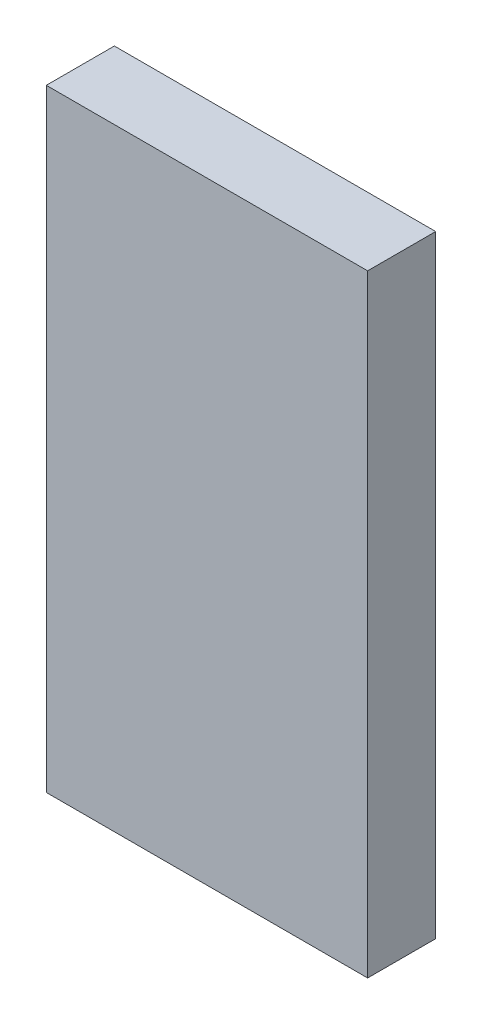
ISO-10303-21;
HEADER;
FILE_DESCRIPTION(('STEP AP214'),'2;1');
FILE_NAME('part.step','',(''),(''),'','','');
FILE_SCHEMA(('AUTOMOTIVE_DESIGN { 1 0 10303 214 1 1 1 1 }'));
ENDSEC;
DATA;
#1=APPLICATION_CONTEXT('core data for automotive mechanical design processes');
#2=APPLICATION_PROTOCOL_DEFINITION('international standard','automotive_design',2000,#1);
#3=PRODUCT_CONTEXT('',#1,'mechanical');
#4=PRODUCT('Part','Part','',(#3));
#5=PRODUCT_RELATED_PRODUCT_CATEGORY('part','',(#4));
#6=PRODUCT_DEFINITION_FORMATION('','',#4);
#7=PRODUCT_DEFINITION_CONTEXT('part definition',#1,'design');
#8=PRODUCT_DEFINITION('design','',#6,#7);
#9=PRODUCT_DEFINITION_SHAPE('','',#8);
#10=(LENGTH_UNIT() NAMED_UNIT(*) SI_UNIT(.MILLI.,.METRE.));
#11=(NAMED_UNIT(*) PLANE_ANGLE_UNIT() SI_UNIT($,.RADIAN.));
#12=(NAMED_UNIT(*) SI_UNIT($,.STERADIAN.) SOLID_ANGLE_UNIT());
#13=UNCERTAINTY_MEASURE_WITH_UNIT(LENGTH_MEASURE(1.E-05),#10,'distance_accuracy_value','');
#14=(GEOMETRIC_REPRESENTATION_CONTEXT(3) GLOBAL_UNCERTAINTY_ASSIGNED_CONTEXT((#13)) GLOBAL_UNIT_ASSIGNED_CONTEXT((#10,
#11,#12)) REPRESENTATION_CONTEXT('',''));
#15=CARTESIAN_POINT('',(0.,0.,0.));
#16=DIRECTION('',(0.,0.,1.));
#17=DIRECTION('',(1.,0.,0.));
#18=AXIS2_PLACEMENT_3D('',#15,#16,#17);
#19=CARTESIAN_POINT('',(0.,0.,18.));
#20=DIRECTION('',(1.,0.,0.));
#21=DIRECTION('',(0.,0.,-1.));
#22=AXIS2_PLACEMENT_3D('',#19,#20,#21);
#23=PLANE('',#22);
#24=DIRECTION('',(0.,-1.,0.));
#25=VECTOR('',#24,1.);
#26=CARTESIAN_POINT('',(0.,0.,0.));
#27=LINE('',#26,#25);
#28=CARTESIAN_POINT('',(0.,162.,0.));
#29=VERTEX_POINT('',#28);
#30=CARTESIAN_POINT('',(0.,0.,0.));
#31=VERTEX_POINT('',#30);
#32=EDGE_CURVE('E98',#29,#31,#27,.T.);
#33=ORIENTED_EDGE('',*,*,#32,.T.);
#34=DIRECTION('',(0.,0.,-1.));
#35=VECTOR('',#34,1.);
#36=CARTESIAN_POINT('',(0.,0.,18.));
#37=LINE('',#36,#35);
#38=CARTESIAN_POINT('',(0.,0.,18.));
#39=VERTEX_POINT('',#38);
#40=EDGE_CURVE('E11',#39,#31,#37,.T.);
#41=ORIENTED_EDGE('',*,*,#40,.F.);
#42=DIRECTION('',(0.,-1.,0.));
#43=VECTOR('',#42,1.);
#44=CARTESIAN_POINT('',(0.,0.,18.));
#45=LINE('',#44,#43);
#46=CARTESIAN_POINT('',(0.,162.,18.));
#47=VERTEX_POINT('',#46);
#48=EDGE_CURVE('E86',#47,#39,#45,.T.);
#49=ORIENTED_EDGE('',*,*,#48,.F.);
#50=DIRECTION('',(0.,0.,-1.));
#51=VECTOR('',#50,1.);
#52=CARTESIAN_POINT('',(0.,162.,18.));
#53=LINE('',#52,#51);
#54=EDGE_CURVE('E94',#47,#29,#53,.T.);
#55=ORIENTED_EDGE('',*,*,#54,.T.);
#56=EDGE_LOOP('',(#33,#41,#49,#55));
#57=FACE_BOUND('',#56,.T.);
#58=ADVANCED_FACE('F35',(#57),#23,.F.);
#59=CARTESIAN_POINT('',(0.,0.,18.));
#60=DIRECTION('',(0.,1.,0.));
#61=DIRECTION('',(0.,0.,1.));
#62=AXIS2_PLACEMENT_3D('',#59,#60,#61);
#63=PLANE('',#62);
#64=DIRECTION('',(1.,0.,0.));
#65=VECTOR('',#64,1.);
#66=CARTESIAN_POINT('',(0.,0.,0.));
#67=LINE('',#66,#65);
#68=CARTESIAN_POINT('',(85.,0.,0.));
#69=VERTEX_POINT('',#68);
#70=EDGE_CURVE('E90',#31,#69,#67,.T.);
#71=ORIENTED_EDGE('',*,*,#70,.T.);
#72=DIRECTION('',(0.,0.,-1.));
#73=VECTOR('',#72,1.);
#74=CARTESIAN_POINT('',(85.,0.,18.));
#75=LINE('',#74,#73);
#76=CARTESIAN_POINT('',(85.,0.,18.));
#77=VERTEX_POINT('',#76);
#78=EDGE_CURVE('E43',#77,#69,#75,.T.);
#79=ORIENTED_EDGE('',*,*,#78,.F.);
#80=DIRECTION('',(1.,0.,0.));
#81=VECTOR('',#80,1.);
#82=CARTESIAN_POINT('',(0.,0.,18.));
#83=LINE('',#82,#81);
#84=EDGE_CURVE('E81',#39,#77,#83,.T.);
#85=ORIENTED_EDGE('',*,*,#84,.F.);
#86=ORIENTED_EDGE('',*,*,#40,.T.);
#87=EDGE_LOOP('',(#71,#79,#85,#86));
#88=FACE_BOUND('',#87,.T.);
#89=ADVANCED_FACE('F89',(#88),#63,.F.);
#90=CARTESIAN_POINT('',(85.,0.,18.));
#91=DIRECTION('',(-1.,0.,0.));
#92=DIRECTION('',(0.,0.,1.));
#93=AXIS2_PLACEMENT_3D('',#90,#91,#92);
#94=PLANE('',#93);
#95=DIRECTION('',(0.,1.,0.));
#96=VECTOR('',#95,1.);
#97=CARTESIAN_POINT('',(85.,0.,0.));
#98=LINE('',#97,#96);
#99=CARTESIAN_POINT('',(85.,162.,0.));
#100=VERTEX_POINT('',#99);
#101=EDGE_CURVE('E68',#69,#100,#98,.T.);
#102=ORIENTED_EDGE('',*,*,#101,.T.);
#103=DIRECTION('',(0.,0.,-1.));
#104=VECTOR('',#103,1.);
#105=CARTESIAN_POINT('',(85.,162.,18.));
#106=LINE('',#105,#104);
#107=CARTESIAN_POINT('',(85.,162.,18.));
#108=VERTEX_POINT('',#107);
#109=EDGE_CURVE('E91',#108,#100,#106,.T.);
#110=ORIENTED_EDGE('',*,*,#109,.F.);
#111=DIRECTION('',(0.,1.,0.));
#112=VECTOR('',#111,1.);
#113=CARTESIAN_POINT('',(85.,0.,18.));
#114=LINE('',#113,#112);
#115=EDGE_CURVE('E84',#77,#108,#114,.T.);
#116=ORIENTED_EDGE('',*,*,#115,.F.);
#117=ORIENTED_EDGE('',*,*,#78,.T.);
#118=EDGE_LOOP('',(#102,#110,#116,#117));
#119=FACE_BOUND('',#118,.T.);
#120=ADVANCED_FACE('F92',(#119),#94,.F.);
#121=CARTESIAN_POINT('',(0.,162.,18.));
#122=DIRECTION('',(0.,-1.,0.));
#123=DIRECTION('',(0.,0.,-1.));
#124=AXIS2_PLACEMENT_3D('',#121,#122,#123);
#125=PLANE('',#124);
#126=DIRECTION('',(-1.,0.,0.));
#127=VECTOR('',#126,1.);
#128=CARTESIAN_POINT('',(0.,162.,0.));
#129=LINE('',#128,#127);
#130=EDGE_CURVE('E74',#100,#29,#129,.T.);
#131=ORIENTED_EDGE('',*,*,#130,.T.);
#132=ORIENTED_EDGE('',*,*,#54,.F.);
#133=DIRECTION('',(-1.,0.,0.));
#134=VECTOR('',#133,1.);
#135=CARTESIAN_POINT('',(0.,162.,18.));
#136=LINE('',#135,#134);
#137=EDGE_CURVE('E51',#108,#47,#136,.T.);
#138=ORIENTED_EDGE('',*,*,#137,.F.);
#139=ORIENTED_EDGE('',*,*,#109,.T.);
#140=EDGE_LOOP('',(#131,#132,#138,#139));
#141=FACE_BOUND('',#140,.T.);
#142=ADVANCED_FACE('F105',(#141),#125,.F.);
#143=CARTESIAN_POINT('',(0.,0.,18.));
#144=DIRECTION('',(0.,0.,-1.));
#145=DIRECTION('',(-1.,0.,0.));
#146=AXIS2_PLACEMENT_3D('',#143,#144,#145);
#147=PLANE('',#146);
#148=ORIENTED_EDGE('',*,*,#48,.T.);
#149=ORIENTED_EDGE('',*,*,#84,.T.);
#150=ORIENTED_EDGE('',*,*,#115,.T.);
#151=ORIENTED_EDGE('',*,*,#137,.T.);
#152=EDGE_LOOP('',(#148,#149,#150,#151));
#153=FACE_BOUND('',#152,.T.);
#154=ADVANCED_FACE('F82',(#153),#147,.F.);
#155=CARTESIAN_POINT('',(0.,0.,0.));
#156=DIRECTION('',(0.,0.,-1.));
#157=DIRECTION('',(-1.,0.,0.));
#158=AXIS2_PLACEMENT_3D('',#155,#156,#157);
#159=PLANE('',#158);
#160=ORIENTED_EDGE('',*,*,#32,.F.);
#161=ORIENTED_EDGE('',*,*,#130,.F.);
#162=ORIENTED_EDGE('',*,*,#101,.F.);
#163=ORIENTED_EDGE('',*,*,#70,.F.);
#164=EDGE_LOOP('',(#160,#161,#162,#163));
#165=FACE_BOUND('',#164,.T.);
#166=ADVANCED_FACE('F108',(#165),#159,.T.);
#167=CLOSED_SHELL('',(#58,#89,#120,#142,#154,#166));
#168=MANIFOLD_SOLID_BREP('B2',#167);
#169=ADVANCED_BREP_SHAPE_REPRESENTATION('',(#18,#168),#14);
#170=SHAPE_DEFINITION_REPRESENTATION(#9,#169);
ENDSEC;
END-ISO-10303-21;
